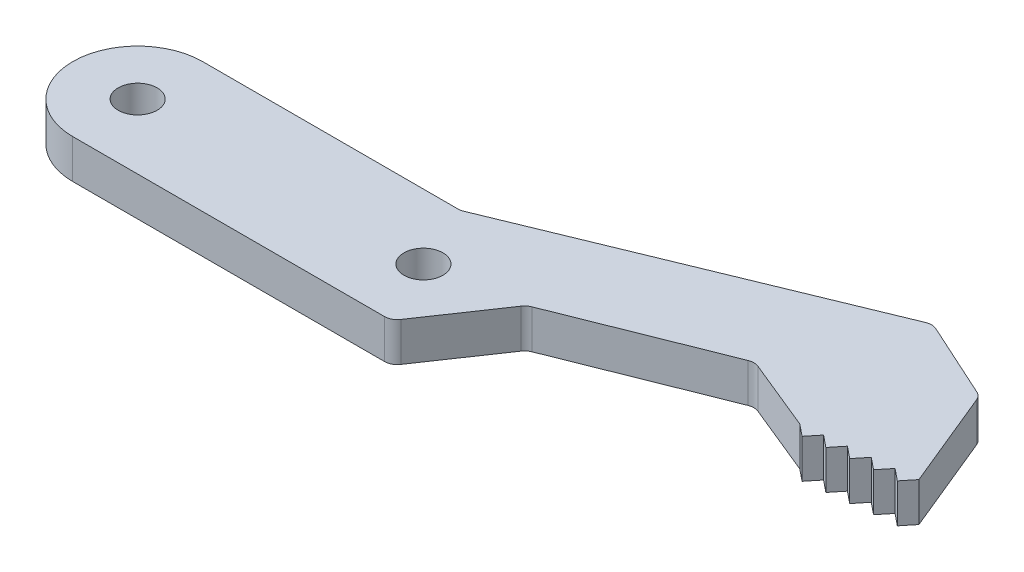
ISO-10303-21;
HEADER;
FILE_DESCRIPTION(('STEP AP214'),'2;1');
FILE_NAME('part.step','',(''),(''),'','','');
FILE_SCHEMA(('AUTOMOTIVE_DESIGN { 1 0 10303 214 1 1 1 1 }'));
ENDSEC;
DATA;
#1=APPLICATION_CONTEXT('core data for automotive mechanical design processes');
#2=APPLICATION_PROTOCOL_DEFINITION('international standard','automotive_design',2000,#1);
#3=PRODUCT_CONTEXT('',#1,'mechanical');
#4=PRODUCT('Part','Part','',(#3));
#5=PRODUCT_RELATED_PRODUCT_CATEGORY('part','',(#4));
#6=PRODUCT_DEFINITION_FORMATION('','',#4);
#7=PRODUCT_DEFINITION_CONTEXT('part definition',#1,'design');
#8=PRODUCT_DEFINITION('design','',#6,#7);
#9=PRODUCT_DEFINITION_SHAPE('','',#8);
#10=(LENGTH_UNIT() NAMED_UNIT(*) SI_UNIT(.MILLI.,.METRE.));
#11=(NAMED_UNIT(*) PLANE_ANGLE_UNIT() SI_UNIT($,.RADIAN.));
#12=(NAMED_UNIT(*) SI_UNIT($,.STERADIAN.) SOLID_ANGLE_UNIT());
#13=UNCERTAINTY_MEASURE_WITH_UNIT(LENGTH_MEASURE(1.E-05),#10,'distance_accuracy_value','');
#14=(GEOMETRIC_REPRESENTATION_CONTEXT(3) GLOBAL_UNCERTAINTY_ASSIGNED_CONTEXT((#13)) GLOBAL_UNIT_ASSIGNED_CONTEXT((#10,
#11,#12)) REPRESENTATION_CONTEXT('',''));
#15=CARTESIAN_POINT('',(0.,0.,0.));
#16=DIRECTION('',(0.,0.,1.));
#17=DIRECTION('',(1.,0.,0.));
#18=AXIS2_PLACEMENT_3D('',#15,#16,#17);
#19=CARTESIAN_POINT('',(29.3927079970185,3.,-0.393076672311641));
#20=DIRECTION('',(0.,-1.,0.));
#21=DIRECTION('',(0.,0.,-1.));
#22=AXIS2_PLACEMENT_3D('',#19,#20,#21);
#23=PLANE('',#22);
#24=CARTESIAN_POINT('',(29.3927079970185,3.,-0.393076672311641));
#25=DIRECTION('',(0.,-1.,0.));
#26=DIRECTION('',(0.,0.,-1.));
#27=AXIS2_PLACEMENT_3D('',#24,#25,#26);
#28=CIRCLE('',#27,1.);
#29=CARTESIAN_POINT('',(28.5649413257824,3.,-0.954149161381216));
#30=VERTEX_POINT('',#29);
#31=CARTESIAN_POINT('',(29.022312673,3.,-1.32195088551018));
#32=VERTEX_POINT('',#31);
#33=EDGE_CURVE('E285',#30,#32,#28,.T.);
#34=ORIENTED_EDGE('',*,*,#33,.T.);
#35=DIRECTION('',(0.92887421319854,0.,-0.370395324018532));
#36=VECTOR('',#35,1.);
#37=CARTESIAN_POINT('',(29.022312673,3.,-1.32195088551018));
#38=LINE('',#37,#36);
#39=CARTESIAN_POINT('',(40.9295532164884,3.,-6.07004934341117));
#40=VERTEX_POINT('',#39);
#41=EDGE_CURVE('E148',#32,#40,#38,.T.);
#42=ORIENTED_EDGE('',*,*,#41,.T.);
#43=CARTESIAN_POINT('',(41.2999485405069,3.,-5.14117513021263));
#44=DIRECTION('',(0.,-1.,0.));
#45=DIRECTION('',(0.,0.,-1.));
#46=AXIS2_PLACEMENT_3D('',#43,#44,#45);
#47=CIRCLE('',#46,1.);
#48=CARTESIAN_POINT('',(41.6787586893829,3.,-6.06664953348294));
#49=VERTEX_POINT('',#48);
#50=EDGE_CURVE('E351',#40,#49,#47,.T.);
#51=ORIENTED_EDGE('',*,*,#50,.T.);
#52=DIRECTION('',(0.925474403270305,0.,0.378810148876022));
#53=VECTOR('',#52,1.);
#54=CARTESIAN_POINT('',(41.6787586893829,3.,-6.06664953348294));
#55=LINE('',#54,#53);
#56=CARTESIAN_POINT('',(47.1445862437582,3.,-3.82940672883367));
#57=VERTEX_POINT('',#56);
#58=EDGE_CURVE('E370',#49,#57,#55,.T.);
#59=ORIENTED_EDGE('',*,*,#58,.T.);
#60=DIRECTION('',(0.777249081254573,0.,0.629193027368329));
#61=VECTOR('',#60,1.);
#62=CARTESIAN_POINT('',(47.1445862437582,3.,-3.82940672883367));
#63=LINE('',#62,#61);
#64=CARTESIAN_POINT('',(48.0617401596386,3.,-3.08695895653906));
#65=VERTEX_POINT('',#64);
#66=EDGE_CURVE('E367',#57,#65,#63,.T.);
#67=ORIENTED_EDGE('',*,*,#66,.T.);
#68=DIRECTION('',(0.629193027368274,0.,-0.777249081254617));
#69=VECTOR('',#68,1.);
#70=CARTESIAN_POINT('',(48.0617401596386,3.,-3.08695895653906));
#71=LINE('',#70,#69);
#72=CARTESIAN_POINT('',(48.8041879319331,3.,-4.0041128724195));
#73=VERTEX_POINT('',#72);
#74=EDGE_CURVE('E369',#65,#73,#71,.T.);
#75=ORIENTED_EDGE('',*,*,#74,.T.);
#76=DIRECTION('',(0.777249081254579,0.,0.62919302736832));
#77=VECTOR('',#76,1.);
#78=CARTESIAN_POINT('',(48.8041879319331,3.,-4.0041128724195));
#79=LINE('',#78,#77);
#80=CARTESIAN_POINT('',(49.7213418478136,3.,-3.26166510012488));
#81=VERTEX_POINT('',#80);
#82=EDGE_CURVE('E372',#73,#81,#79,.T.);
#83=ORIENTED_EDGE('',*,*,#82,.T.);
#84=DIRECTION('',(0.629193027368325,0.,-0.777249081254575));
#85=VECTOR('',#84,1.);
#86=CARTESIAN_POINT('',(49.7213418478136,3.,-3.26166510012488));
#87=LINE('',#86,#85);
#88=CARTESIAN_POINT('',(50.4637896201082,3.,-4.17881901600528));
#89=VERTEX_POINT('',#88);
#90=EDGE_CURVE('E378',#81,#89,#87,.T.);
#91=ORIENTED_EDGE('',*,*,#90,.T.);
#92=DIRECTION('',(0.777249081254577,0.,0.629193027368323));
#93=VECTOR('',#92,1.);
#94=CARTESIAN_POINT('',(50.4637896201082,3.,-4.17881901600528));
#95=LINE('',#94,#93);
#96=CARTESIAN_POINT('',(51.3809435359886,3.,-3.43637124371065));
#97=VERTEX_POINT('',#96);
#98=EDGE_CURVE('E380',#89,#97,#95,.T.);
#99=ORIENTED_EDGE('',*,*,#98,.T.);
#100=DIRECTION('',(0.629193027368326,0.,-0.777249081254575));
#101=VECTOR('',#100,1.);
#102=CARTESIAN_POINT('',(51.3809435359886,3.,-3.43637124371065));
#103=LINE('',#102,#101);
#104=CARTESIAN_POINT('',(52.1233913082832,3.,-4.35352515959105));
#105=VERTEX_POINT('',#104);
#106=EDGE_CURVE('E382',#97,#105,#103,.T.);
#107=ORIENTED_EDGE('',*,*,#106,.T.);
#108=DIRECTION('',(0.777249081254583,0.,0.629193027368317));
#109=VECTOR('',#108,1.);
#110=CARTESIAN_POINT('',(52.1233913082832,3.,-4.35352515959105));
#111=LINE('',#110,#109);
#112=CARTESIAN_POINT('',(53.0405452241636,3.,-3.61107738729644));
#113=VERTEX_POINT('',#112);
#114=EDGE_CURVE('E384',#105,#113,#111,.T.);
#115=ORIENTED_EDGE('',*,*,#114,.T.);
#116=DIRECTION('',(0.629193027368326,0.,-0.777249081254575));
#117=VECTOR('',#116,1.);
#118=CARTESIAN_POINT('',(53.0405452241636,3.,-3.61107738729644));
#119=LINE('',#118,#117);
#120=CARTESIAN_POINT('',(53.7829929964582,3.,-4.52823130317683));
#121=VERTEX_POINT('',#120);
#122=EDGE_CURVE('E386',#113,#121,#119,.T.);
#123=ORIENTED_EDGE('',*,*,#122,.T.);
#124=DIRECTION('',(0.777249081254587,0.,0.629193027368311));
#125=VECTOR('',#124,1.);
#126=CARTESIAN_POINT('',(53.7829929964582,3.,-4.52823130317683));
#127=LINE('',#126,#125);
#128=CARTESIAN_POINT('',(54.7001469123387,3.,-3.78578353088222));
#129=VERTEX_POINT('',#128);
#130=EDGE_CURVE('E388',#121,#129,#127,.T.);
#131=ORIENTED_EDGE('',*,*,#130,.T.);
#132=DIRECTION('',(0.629193027368273,0.,-0.777249081254618));
#133=VECTOR('',#132,1.);
#134=CARTESIAN_POINT('',(54.7001469123387,3.,-3.78578353088222));
#135=LINE('',#134,#133);
#136=CARTESIAN_POINT('',(55.4425946846332,3.,-4.70293744676266));
#137=VERTEX_POINT('',#136);
#138=EDGE_CURVE('E390',#129,#137,#135,.T.);
#139=ORIENTED_EDGE('',*,*,#138,.T.);
#140=DIRECTION('',(-0.380263412733204,0.,-0.92487822816655));
#141=VECTOR('',#140,1.);
#142=CARTESIAN_POINT('',(52.341745918113,3.,-12.2448345027485));
#143=LINE('',#142,#141);
#144=CARTESIAN_POINT('',(52.341745918113,3.,-12.2448345027485));
#145=VERTEX_POINT('',#144);
#146=EDGE_CURVE('E392',#137,#145,#143,.T.);
#147=ORIENTED_EDGE('',*,*,#146,.T.);
#148=CARTESIAN_POINT('',(51.4168676899464,3.,-11.8645710900153));
#149=DIRECTION('',(0.,1.,0.));
#150=DIRECTION('',(0.,0.,-1.));
#151=AXIS2_PLACEMENT_3D('',#148,#149,#150);
#152=CIRCLE('',#151,1.);
#153=CARTESIAN_POINT('',(51.8314021080849,3.,-12.7746047246566));
#154=VERTEX_POINT('',#153);
#155=EDGE_CURVE('E394',#145,#154,#152,.T.);
#156=ORIENTED_EDGE('',*,*,#155,.T.);
#157=DIRECTION('',(-0.910033634641374,0.,-0.414534418138482));
#158=VECTOR('',#157,1.);
#159=CARTESIAN_POINT('',(46.0241839243038,3.,-15.4198825684427));
#160=LINE('',#159,#158);
#161=CARTESIAN_POINT('',(46.0241839243038,3.,-15.4198825684427));
#162=VERTEX_POINT('',#161);
#163=EDGE_CURVE('E396',#154,#162,#160,.T.);
#164=ORIENTED_EDGE('',*,*,#163,.T.);
#165=CARTESIAN_POINT('',(45.6096495061653,3.,-14.5098489338013));
#166=DIRECTION('',(0.,1.,0.));
#167=DIRECTION('',(0.,0.,-1.));
#168=AXIS2_PLACEMENT_3D('',#165,#166,#167);
#169=CIRCLE('',#168,1.);
#170=CARTESIAN_POINT('',(45.2293860934321,3.,-15.4347271619678));
#171=VERTEX_POINT('',#170);
#172=EDGE_CURVE('E398',#162,#171,#169,.T.);
#173=ORIENTED_EDGE('',*,*,#172,.T.);
#174=DIRECTION('',(-0.924878228166549,0.,0.380263412733207));
#175=VECTOR('',#174,1.);
#176=CARTESIAN_POINT('',(20.0327114807882,3.,-5.07512177183345));
#177=LINE('',#176,#175);
#178=CARTESIAN_POINT('',(20.0327114807882,3.,-5.07512177183345));
#179=VERTEX_POINT('',#178);
#180=EDGE_CURVE('E400',#171,#179,#177,.T.);
#181=ORIENTED_EDGE('',*,*,#180,.T.);
#182=CARTESIAN_POINT('',(19.652448068055,3.,-6.));
#183=DIRECTION('',(0.,-1.,0.));
#184=DIRECTION('',(0.,0.,1.));
#185=AXIS2_PLACEMENT_3D('',#182,#183,#184);
#186=CIRCLE('',#185,1.);
#187=CARTESIAN_POINT('',(19.652448068055,3.,-5.));
#188=VERTEX_POINT('',#187);
#189=EDGE_CURVE('E402',#179,#188,#186,.T.);
#190=ORIENTED_EDGE('',*,*,#189,.T.);
#191=DIRECTION('',(-1.,0.,0.));
#192=VECTOR('',#191,1.);
#193=CARTESIAN_POINT('',(0.,3.,-5.));
#194=LINE('',#193,#192);
#195=CARTESIAN_POINT('',(0.,3.,-5.));
#196=VERTEX_POINT('',#195);
#197=EDGE_CURVE('E404',#188,#196,#194,.T.);
#198=ORIENTED_EDGE('',*,*,#197,.T.);
#199=CARTESIAN_POINT('',(0.,3.,0.));
#200=DIRECTION('',(0.,1.,0.));
#201=DIRECTION('',(0.,0.,1.));
#202=AXIS2_PLACEMENT_3D('',#199,#200,#201);
#203=CIRCLE('',#202,5.);
#204=CARTESIAN_POINT('',(0.,3.,5.));
#205=VERTEX_POINT('',#204);
#206=EDGE_CURVE('E218',#196,#205,#203,.T.);
#207=ORIENTED_EDGE('',*,*,#206,.T.);
#208=DIRECTION('',(1.,0.,0.));
#209=VECTOR('',#208,1.);
#210=CARTESIAN_POINT('',(0.,3.,5.));
#211=LINE('',#210,#209);
#212=CARTESIAN_POINT('',(23.9988758721515,3.,5.));
#213=VERTEX_POINT('',#212);
#214=EDGE_CURVE('E212',#205,#213,#211,.T.);
#215=ORIENTED_EDGE('',*,*,#214,.T.);
#216=CARTESIAN_POINT('',(23.9988758721515,3.,4.));
#217=DIRECTION('',(0.,1.,0.));
#218=DIRECTION('',(0.,0.,1.));
#219=AXIS2_PLACEMENT_3D('',#216,#217,#218);
#220=CIRCLE('',#219,1.);
#221=CARTESIAN_POINT('',(24.8266425433876,3.,4.56107248906957));
#222=VERTEX_POINT('',#221);
#223=EDGE_CURVE('E216',#213,#222,#220,.T.);
#224=ORIENTED_EDGE('',*,*,#223,.T.);
#225=DIRECTION('',(0.561072489069578,0.,-0.827766671236085));
#226=VECTOR('',#225,1.);
#227=CARTESIAN_POINT('',(24.8266425433876,3.,4.56107248906957));
#228=LINE('',#227,#226);
#229=EDGE_CURVE('E54',#222,#30,#228,.T.);
#230=ORIENTED_EDGE('',*,*,#229,.T.);
#231=EDGE_LOOP('',(#34,#42,#51,#59,#67,#75,#83,#91,#99,#107,#115,#123,#131,#139,#147,#156,#164,
#173,#181,#190,#198,#207,#215,#224,#230));
#232=FACE_BOUND('',#231,.T.);
#233=CARTESIAN_POINT('',(0.,3.,0.));
#234=DIRECTION('',(0.,1.,0.));
#235=DIRECTION('',(0.,0.,1.));
#236=AXIS2_PLACEMENT_3D('',#233,#234,#235);
#237=CIRCLE('',#236,1.5);
#238=CARTESIAN_POINT('',(0.,3.,1.5));
#239=VERTEX_POINT('',#238);
#240=EDGE_CURVE('E240',#239,#239,#237,.T.);
#241=ORIENTED_EDGE('',*,*,#240,.F.);
#242=EDGE_LOOP('',(#241));
#243=FACE_BOUND('',#242,.T.);
#244=CARTESIAN_POINT('',(22.,3.,0.));
#245=DIRECTION('',(0.,1.,0.));
#246=DIRECTION('',(0.,0.,1.));
#247=AXIS2_PLACEMENT_3D('',#244,#245,#246);
#248=CIRCLE('',#247,1.5);
#249=CARTESIAN_POINT('',(22.,3.,1.5));
#250=VERTEX_POINT('',#249);
#251=EDGE_CURVE('E445',#250,#250,#248,.T.);
#252=ORIENTED_EDGE('',*,*,#251,.F.);
#253=EDGE_LOOP('',(#252));
#254=FACE_BOUND('',#253,.T.);
#255=ADVANCED_FACE('F37',(#232,#243,#254),#23,.F.);
#256=CARTESIAN_POINT('',(29.3927079970185,0.,-0.393076672311641));
#257=DIRECTION('',(0.,-1.,0.));
#258=DIRECTION('',(0.,0.,-1.));
#259=AXIS2_PLACEMENT_3D('',#256,#257,#258);
#260=PLANE('',#259);
#261=CARTESIAN_POINT('',(0.,0.,0.));
#262=DIRECTION('',(0.,1.,0.));
#263=DIRECTION('',(0.,0.,1.));
#264=AXIS2_PLACEMENT_3D('',#261,#262,#263);
#265=CIRCLE('',#264,1.5);
#266=CARTESIAN_POINT('',(0.,0.,1.5));
#267=VERTEX_POINT('',#266);
#268=EDGE_CURVE('E450',#267,#267,#265,.T.);
#269=ORIENTED_EDGE('',*,*,#268,.T.);
#270=EDGE_LOOP('',(#269));
#271=FACE_BOUND('',#270,.T.);
#272=CARTESIAN_POINT('',(29.3927079970185,0.,-0.393076672311641));
#273=DIRECTION('',(0.,-1.,0.));
#274=DIRECTION('',(0.,0.,-1.));
#275=AXIS2_PLACEMENT_3D('',#272,#273,#274);
#276=CIRCLE('',#275,1.);
#277=CARTESIAN_POINT('',(28.5649413257824,0.,-0.954149161381216));
#278=VERTEX_POINT('',#277);
#279=CARTESIAN_POINT('',(29.022312673,0.,-1.32195088551018));
#280=VERTEX_POINT('',#279);
#281=EDGE_CURVE('E236',#278,#280,#276,.T.);
#282=ORIENTED_EDGE('',*,*,#281,.F.);
#283=DIRECTION('',(0.561072489069578,0.,-0.827766671236085));
#284=VECTOR('',#283,1.);
#285=CARTESIAN_POINT('',(24.8266425433876,0.,4.56107248906957));
#286=LINE('',#285,#284);
#287=CARTESIAN_POINT('',(24.8266425433876,0.,4.56107248906957));
#288=VERTEX_POINT('',#287);
#289=EDGE_CURVE('E140',#288,#278,#286,.T.);
#290=ORIENTED_EDGE('',*,*,#289,.F.);
#291=CARTESIAN_POINT('',(23.9988758721515,0.,4.));
#292=DIRECTION('',(0.,1.,0.));
#293=DIRECTION('',(0.,0.,1.));
#294=AXIS2_PLACEMENT_3D('',#291,#292,#293);
#295=CIRCLE('',#294,1.);
#296=CARTESIAN_POINT('',(23.9988758721515,0.,5.));
#297=VERTEX_POINT('',#296);
#298=EDGE_CURVE('E134',#297,#288,#295,.T.);
#299=ORIENTED_EDGE('',*,*,#298,.F.);
#300=DIRECTION('',(1.,0.,0.));
#301=VECTOR('',#300,1.);
#302=CARTESIAN_POINT('',(0.,0.,5.));
#303=LINE('',#302,#301);
#304=CARTESIAN_POINT('',(0.,0.,5.));
#305=VERTEX_POINT('',#304);
#306=EDGE_CURVE('E226',#305,#297,#303,.T.);
#307=ORIENTED_EDGE('',*,*,#306,.F.);
#308=CARTESIAN_POINT('',(0.,0.,0.));
#309=DIRECTION('',(0.,1.,0.));
#310=DIRECTION('',(0.,0.,1.));
#311=AXIS2_PLACEMENT_3D('',#308,#309,#310);
#312=CIRCLE('',#311,5.);
#313=CARTESIAN_POINT('',(0.,0.,-5.));
#314=VERTEX_POINT('',#313);
#315=EDGE_CURVE('E280',#314,#305,#312,.T.);
#316=ORIENTED_EDGE('',*,*,#315,.F.);
#317=DIRECTION('',(-1.,0.,0.));
#318=VECTOR('',#317,1.);
#319=CARTESIAN_POINT('',(0.,0.,-5.));
#320=LINE('',#319,#318);
#321=CARTESIAN_POINT('',(19.652448068055,0.,-5.));
#322=VERTEX_POINT('',#321);
#323=EDGE_CURVE('E278',#322,#314,#320,.T.);
#324=ORIENTED_EDGE('',*,*,#323,.F.);
#325=CARTESIAN_POINT('',(19.652448068055,0.,-6.));
#326=DIRECTION('',(0.,-1.,0.));
#327=DIRECTION('',(0.,0.,1.));
#328=AXIS2_PLACEMENT_3D('',#325,#326,#327);
#329=CIRCLE('',#328,1.);
#330=CARTESIAN_POINT('',(20.0327114807882,0.,-5.07512177183345));
#331=VERTEX_POINT('',#330);
#332=EDGE_CURVE('E276',#331,#322,#329,.T.);
#333=ORIENTED_EDGE('',*,*,#332,.F.);
#334=DIRECTION('',(-0.924878228166549,0.,0.380263412733207));
#335=VECTOR('',#334,1.);
#336=CARTESIAN_POINT('',(20.0327114807882,0.,-5.07512177183345));
#337=LINE('',#336,#335);
#338=CARTESIAN_POINT('',(45.2293860934321,0.,-15.4347271619678));
#339=VERTEX_POINT('',#338);
#340=EDGE_CURVE('E274',#339,#331,#337,.T.);
#341=ORIENTED_EDGE('',*,*,#340,.F.);
#342=CARTESIAN_POINT('',(45.6096495061653,0.,-14.5098489338013));
#343=DIRECTION('',(0.,1.,0.));
#344=DIRECTION('',(0.,0.,-1.));
#345=AXIS2_PLACEMENT_3D('',#342,#343,#344);
#346=CIRCLE('',#345,1.);
#347=CARTESIAN_POINT('',(46.0241839243038,0.,-15.4198825684427));
#348=VERTEX_POINT('',#347);
#349=EDGE_CURVE('E272',#348,#339,#346,.T.);
#350=ORIENTED_EDGE('',*,*,#349,.F.);
#351=DIRECTION('',(-0.910033634641374,0.,-0.414534418138482));
#352=VECTOR('',#351,1.);
#353=CARTESIAN_POINT('',(46.0241839243038,0.,-15.4198825684427));
#354=LINE('',#353,#352);
#355=CARTESIAN_POINT('',(51.8314021080849,0.,-12.7746047246566));
#356=VERTEX_POINT('',#355);
#357=EDGE_CURVE('E270',#356,#348,#354,.T.);
#358=ORIENTED_EDGE('',*,*,#357,.F.);
#359=CARTESIAN_POINT('',(51.4168676899464,0.,-11.8645710900153));
#360=DIRECTION('',(0.,1.,0.));
#361=DIRECTION('',(0.,0.,-1.));
#362=AXIS2_PLACEMENT_3D('',#359,#360,#361);
#363=CIRCLE('',#362,1.);
#364=CARTESIAN_POINT('',(52.341745918113,0.,-12.2448345027485));
#365=VERTEX_POINT('',#364);
#366=EDGE_CURVE('E268',#365,#356,#363,.T.);
#367=ORIENTED_EDGE('',*,*,#366,.F.);
#368=DIRECTION('',(-0.380263412733204,0.,-0.92487822816655));
#369=VECTOR('',#368,1.);
#370=CARTESIAN_POINT('',(52.341745918113,0.,-12.2448345027485));
#371=LINE('',#370,#369);
#372=CARTESIAN_POINT('',(55.4425946846332,0.,-4.70293744676266));
#373=VERTEX_POINT('',#372);
#374=EDGE_CURVE('E266',#373,#365,#371,.T.);
#375=ORIENTED_EDGE('',*,*,#374,.F.);
#376=DIRECTION('',(0.629193027368273,0.,-0.777249081254618));
#377=VECTOR('',#376,1.);
#378=CARTESIAN_POINT('',(54.7001469123387,0.,-3.78578353088222));
#379=LINE('',#378,#377);
#380=CARTESIAN_POINT('',(54.7001469123387,0.,-3.78578353088222));
#381=VERTEX_POINT('',#380);
#382=EDGE_CURVE('E264',#381,#373,#379,.T.);
#383=ORIENTED_EDGE('',*,*,#382,.F.);
#384=DIRECTION('',(0.777249081254587,0.,0.629193027368311));
#385=VECTOR('',#384,1.);
#386=CARTESIAN_POINT('',(53.7829929964582,0.,-4.52823130317683));
#387=LINE('',#386,#385);
#388=CARTESIAN_POINT('',(53.7829929964582,0.,-4.52823130317683));
#389=VERTEX_POINT('',#388);
#390=EDGE_CURVE('E262',#389,#381,#387,.T.);
#391=ORIENTED_EDGE('',*,*,#390,.F.);
#392=DIRECTION('',(0.629193027368326,0.,-0.777249081254575));
#393=VECTOR('',#392,1.);
#394=CARTESIAN_POINT('',(53.0405452241636,0.,-3.61107738729644));
#395=LINE('',#394,#393);
#396=CARTESIAN_POINT('',(53.0405452241636,0.,-3.61107738729644));
#397=VERTEX_POINT('',#396);
#398=EDGE_CURVE('E260',#397,#389,#395,.T.);
#399=ORIENTED_EDGE('',*,*,#398,.F.);
#400=DIRECTION('',(0.777249081254583,0.,0.629193027368317));
#401=VECTOR('',#400,1.);
#402=CARTESIAN_POINT('',(52.1233913082832,0.,-4.35352515959105));
#403=LINE('',#402,#401);
#404=CARTESIAN_POINT('',(52.1233913082832,0.,-4.35352515959105));
#405=VERTEX_POINT('',#404);
#406=EDGE_CURVE('E258',#405,#397,#403,.T.);
#407=ORIENTED_EDGE('',*,*,#406,.F.);
#408=DIRECTION('',(0.629193027368326,0.,-0.777249081254575));
#409=VECTOR('',#408,1.);
#410=CARTESIAN_POINT('',(51.3809435359886,0.,-3.43637124371065));
#411=LINE('',#410,#409);
#412=CARTESIAN_POINT('',(51.3809435359886,0.,-3.43637124371065));
#413=VERTEX_POINT('',#412);
#414=EDGE_CURVE('E256',#413,#405,#411,.T.);
#415=ORIENTED_EDGE('',*,*,#414,.F.);
#416=DIRECTION('',(0.777249081254577,0.,0.629193027368323));
#417=VECTOR('',#416,1.);
#418=CARTESIAN_POINT('',(50.4637896201082,0.,-4.17881901600528));
#419=LINE('',#418,#417);
#420=CARTESIAN_POINT('',(50.4637896201082,0.,-4.17881901600528));
#421=VERTEX_POINT('',#420);
#422=EDGE_CURVE('E254',#421,#413,#419,.T.);
#423=ORIENTED_EDGE('',*,*,#422,.F.);
#424=DIRECTION('',(0.629193027368325,0.,-0.777249081254575));
#425=VECTOR('',#424,1.);
#426=CARTESIAN_POINT('',(49.7213418478136,0.,-3.26166510012488));
#427=LINE('',#426,#425);
#428=CARTESIAN_POINT('',(49.7213418478136,0.,-3.26166510012488));
#429=VERTEX_POINT('',#428);
#430=EDGE_CURVE('E252',#429,#421,#427,.T.);
#431=ORIENTED_EDGE('',*,*,#430,.F.);
#432=DIRECTION('',(0.777249081254579,0.,0.62919302736832));
#433=VECTOR('',#432,1.);
#434=CARTESIAN_POINT('',(48.8041879319331,0.,-4.0041128724195));
#435=LINE('',#434,#433);
#436=CARTESIAN_POINT('',(48.8041879319331,0.,-4.0041128724195));
#437=VERTEX_POINT('',#436);
#438=EDGE_CURVE('E250',#437,#429,#435,.T.);
#439=ORIENTED_EDGE('',*,*,#438,.F.);
#440=DIRECTION('',(0.629193027368274,0.,-0.777249081254617));
#441=VECTOR('',#440,1.);
#442=CARTESIAN_POINT('',(48.0617401596386,0.,-3.08695895653906));
#443=LINE('',#442,#441);
#444=CARTESIAN_POINT('',(48.0617401596386,0.,-3.08695895653906));
#445=VERTEX_POINT('',#444);
#446=EDGE_CURVE('E248',#445,#437,#443,.T.);
#447=ORIENTED_EDGE('',*,*,#446,.F.);
#448=DIRECTION('',(0.777249081254573,0.,0.629193027368329));
#449=VECTOR('',#448,1.);
#450=CARTESIAN_POINT('',(47.1445862437582,0.,-3.82940672883367));
#451=LINE('',#450,#449);
#452=CARTESIAN_POINT('',(47.1445862437582,0.,-3.82940672883367));
#453=VERTEX_POINT('',#452);
#454=EDGE_CURVE('E246',#453,#445,#451,.T.);
#455=ORIENTED_EDGE('',*,*,#454,.F.);
#456=DIRECTION('',(0.925474403270305,0.,0.378810148876022));
#457=VECTOR('',#456,1.);
#458=CARTESIAN_POINT('',(41.6787586893829,0.,-6.06664953348294));
#459=LINE('',#458,#457);
#460=CARTESIAN_POINT('',(41.6787586893829,0.,-6.06664953348294));
#461=VERTEX_POINT('',#460);
#462=EDGE_CURVE('E244',#461,#453,#459,.T.);
#463=ORIENTED_EDGE('',*,*,#462,.F.);
#464=CARTESIAN_POINT('',(41.2999485405069,0.,-5.14117513021263));
#465=DIRECTION('',(0.,-1.,0.));
#466=DIRECTION('',(0.,0.,-1.));
#467=AXIS2_PLACEMENT_3D('',#464,#465,#466);
#468=CIRCLE('',#467,1.);
#469=CARTESIAN_POINT('',(40.9295532164884,0.,-6.07004934341117));
#470=VERTEX_POINT('',#469);
#471=EDGE_CURVE('E242',#470,#461,#468,.T.);
#472=ORIENTED_EDGE('',*,*,#471,.F.);
#473=DIRECTION('',(0.92887421319854,0.,-0.370395324018532));
#474=VECTOR('',#473,1.);
#475=CARTESIAN_POINT('',(29.022312673,0.,-1.32195088551018));
#476=LINE('',#475,#474);
#477=EDGE_CURVE('E239',#280,#470,#476,.T.);
#478=ORIENTED_EDGE('',*,*,#477,.F.);
#479=EDGE_LOOP('',(#282,#290,#299,#307,#316,#324,#333,#341,#350,#358,#367,#375,#383,#391,#399,
#407,#415,#423,#431,#439,#447,#455,#463,#472,#478));
#480=FACE_BOUND('',#479,.T.);
#481=CARTESIAN_POINT('',(22.,0.,0.));
#482=DIRECTION('',(0.,1.,0.));
#483=DIRECTION('',(0.,0.,1.));
#484=AXIS2_PLACEMENT_3D('',#481,#482,#483);
#485=CIRCLE('',#484,1.5);
#486=CARTESIAN_POINT('',(22.,0.,1.5));
#487=VERTEX_POINT('',#486);
#488=EDGE_CURVE('E448',#487,#487,#485,.T.);
#489=ORIENTED_EDGE('',*,*,#488,.T.);
#490=EDGE_LOOP('',(#489));
#491=FACE_BOUND('',#490,.T.);
#492=ADVANCED_FACE('F355',(#271,#480,#491),#260,.T.);
#493=CARTESIAN_POINT('',(29.3927079970185,3.,-0.393076672311641));
#494=DIRECTION('',(0.,-1.,0.));
#495=DIRECTION('',(0.,0.,-1.));
#496=AXIS2_PLACEMENT_3D('',#493,#494,#495);
#497=CYLINDRICAL_SURFACE('',#496,1.);
#498=ORIENTED_EDGE('',*,*,#281,.T.);
#499=DIRECTION('',(0.,-1.,0.));
#500=VECTOR('',#499,1.);
#501=CARTESIAN_POINT('',(29.022312673,3.,-1.32195088551018));
#502=LINE('',#501,#500);
#503=EDGE_CURVE('E11',#32,#280,#502,.T.);
#504=ORIENTED_EDGE('',*,*,#503,.F.);
#505=ORIENTED_EDGE('',*,*,#33,.F.);
#506=DIRECTION('',(0.,-1.,0.));
#507=VECTOR('',#506,1.);
#508=CARTESIAN_POINT('',(28.5649413257824,3.,-0.954149161381216));
#509=LINE('',#508,#507);
#510=EDGE_CURVE('E232',#30,#278,#509,.T.);
#511=ORIENTED_EDGE('',*,*,#510,.T.);
#512=EDGE_LOOP('',(#498,#504,#505,#511));
#513=FACE_BOUND('',#512,.T.);
#514=ADVANCED_FACE('F39',(#513),#497,.F.);
#515=CARTESIAN_POINT('',(29.022312673,3.,-1.32195088551018));
#516=DIRECTION('',(-0.370395324018532,0.,-0.92887421319854));
#517=DIRECTION('',(-0.92887421319854,0.,0.370395324018532));
#518=AXIS2_PLACEMENT_3D('',#515,#516,#517);
#519=PLANE('',#518);
#520=ORIENTED_EDGE('',*,*,#477,.T.);
#521=DIRECTION('',(0.,-1.,0.));
#522=VECTOR('',#521,1.);
#523=CARTESIAN_POINT('',(40.9295532164884,3.,-6.07004934341117));
#524=LINE('',#523,#522);
#525=EDGE_CURVE('E46',#40,#470,#524,.T.);
#526=ORIENTED_EDGE('',*,*,#525,.F.);
#527=ORIENTED_EDGE('',*,*,#41,.F.);
#528=ORIENTED_EDGE('',*,*,#503,.T.);
#529=EDGE_LOOP('',(#520,#526,#527,#528));
#530=FACE_BOUND('',#529,.T.);
#531=ADVANCED_FACE('F629',(#530),#519,.F.);
#532=CARTESIAN_POINT('',(41.2999485405069,3.,-5.14117513021263));
#533=DIRECTION('',(0.,-1.,0.));
#534=DIRECTION('',(0.,0.,-1.));
#535=AXIS2_PLACEMENT_3D('',#532,#533,#534);
#536=CYLINDRICAL_SURFACE('',#535,1.);
#537=ORIENTED_EDGE('',*,*,#471,.T.);
#538=DIRECTION('',(0.,-1.,0.));
#539=VECTOR('',#538,1.);
#540=CARTESIAN_POINT('',(41.6787586893829,3.,-6.06664953348294));
#541=LINE('',#540,#539);
#542=EDGE_CURVE('E343',#49,#461,#541,.T.);
#543=ORIENTED_EDGE('',*,*,#542,.F.);
#544=ORIENTED_EDGE('',*,*,#50,.F.);
#545=ORIENTED_EDGE('',*,*,#525,.T.);
#546=EDGE_LOOP('',(#537,#543,#544,#545));
#547=FACE_BOUND('',#546,.T.);
#548=ADVANCED_FACE('F349',(#547),#536,.F.);
#549=CARTESIAN_POINT('',(41.6787586893829,3.,-6.06664953348294));
#550=DIRECTION('',(0.378810148876022,0.,-0.925474403270305));
#551=DIRECTION('',(-0.925474403270305,0.,-0.378810148876022));
#552=AXIS2_PLACEMENT_3D('',#549,#550,#551);
#553=PLANE('',#552);
#554=ORIENTED_EDGE('',*,*,#462,.T.);
#555=DIRECTION('',(0.,-1.,0.));
#556=VECTOR('',#555,1.);
#557=CARTESIAN_POINT('',(47.1445862437582,3.,-3.82940672883367));
#558=LINE('',#557,#556);
#559=EDGE_CURVE('E340',#57,#453,#558,.T.);
#560=ORIENTED_EDGE('',*,*,#559,.F.);
#561=ORIENTED_EDGE('',*,*,#58,.F.);
#562=ORIENTED_EDGE('',*,*,#542,.T.);
#563=EDGE_LOOP('',(#554,#560,#561,#562));
#564=FACE_BOUND('',#563,.T.);
#565=ADVANCED_FACE('F361',(#564),#553,.F.);
#566=CARTESIAN_POINT('',(47.1445862437582,3.,-3.82940672883367));
#567=DIRECTION('',(0.629193027368329,0.,-0.777249081254573));
#568=DIRECTION('',(-0.777249081254573,0.,-0.629193027368329));
#569=AXIS2_PLACEMENT_3D('',#566,#567,#568);
#570=PLANE('',#569);
#571=ORIENTED_EDGE('',*,*,#454,.T.);
#572=DIRECTION('',(0.,-1.,0.));
#573=VECTOR('',#572,1.);
#574=CARTESIAN_POINT('',(48.0617401596386,3.,-3.08695895653906));
#575=LINE('',#574,#573);
#576=EDGE_CURVE('E337',#65,#445,#575,.T.);
#577=ORIENTED_EDGE('',*,*,#576,.F.);
#578=ORIENTED_EDGE('',*,*,#66,.F.);
#579=ORIENTED_EDGE('',*,*,#559,.T.);
#580=EDGE_LOOP('',(#571,#577,#578,#579));
#581=FACE_BOUND('',#580,.T.);
#582=ADVANCED_FACE('F365',(#581),#570,.F.);
#583=CARTESIAN_POINT('',(48.0617401596386,3.,-3.08695895653906));
#584=DIRECTION('',(-0.777249081254617,0.,-0.629193027368274));
#585=DIRECTION('',(-0.629193027368274,0.,0.777249081254617));
#586=AXIS2_PLACEMENT_3D('',#583,#584,#585);
#587=PLANE('',#586);
#588=ORIENTED_EDGE('',*,*,#446,.T.);
#589=DIRECTION('',(0.,-1.,0.));
#590=VECTOR('',#589,1.);
#591=CARTESIAN_POINT('',(48.8041879319331,3.,-4.0041128724195));
#592=LINE('',#591,#590);
#593=EDGE_CURVE('E334',#73,#437,#592,.T.);
#594=ORIENTED_EDGE('',*,*,#593,.F.);
#595=ORIENTED_EDGE('',*,*,#74,.F.);
#596=ORIENTED_EDGE('',*,*,#576,.T.);
#597=EDGE_LOOP('',(#588,#594,#595,#596));
#598=FACE_BOUND('',#597,.T.);
#599=ADVANCED_FACE('F602',(#598),#587,.F.);
#600=CARTESIAN_POINT('',(48.8041879319331,3.,-4.0041128724195));
#601=DIRECTION('',(0.62919302736832,0.,-0.77724908125458));
#602=DIRECTION('',(-0.77724908125458,0.,-0.62919302736832));
#603=AXIS2_PLACEMENT_3D('',#600,#601,#602);
#604=PLANE('',#603);
#605=ORIENTED_EDGE('',*,*,#438,.T.);
#606=DIRECTION('',(0.,-1.,0.));
#607=VECTOR('',#606,1.);
#608=CARTESIAN_POINT('',(49.7213418478136,3.,-3.26166510012488));
#609=LINE('',#608,#607);
#610=EDGE_CURVE('E331',#81,#429,#609,.T.);
#611=ORIENTED_EDGE('',*,*,#610,.F.);
#612=ORIENTED_EDGE('',*,*,#82,.F.);
#613=ORIENTED_EDGE('',*,*,#593,.T.);
#614=EDGE_LOOP('',(#605,#611,#612,#613));
#615=FACE_BOUND('',#614,.T.);
#616=ADVANCED_FACE('F594',(#615),#604,.F.);
#617=CARTESIAN_POINT('',(49.7213418478136,3.,-3.26166510012488));
#618=DIRECTION('',(-0.777249081254575,0.,-0.629193027368325));
#619=DIRECTION('',(-0.629193027368325,0.,0.777249081254576));
#620=AXIS2_PLACEMENT_3D('',#617,#618,#619);
#621=PLANE('',#620);
#622=ORIENTED_EDGE('',*,*,#430,.T.);
#623=DIRECTION('',(0.,-1.,0.));
#624=VECTOR('',#623,1.);
#625=CARTESIAN_POINT('',(50.4637896201082,3.,-4.17881901600528));
#626=LINE('',#625,#624);
#627=EDGE_CURVE('E328',#89,#421,#626,.T.);
#628=ORIENTED_EDGE('',*,*,#627,.F.);
#629=ORIENTED_EDGE('',*,*,#90,.F.);
#630=ORIENTED_EDGE('',*,*,#610,.T.);
#631=EDGE_LOOP('',(#622,#628,#629,#630));
#632=FACE_BOUND('',#631,.T.);
#633=ADVANCED_FACE('F586',(#632),#621,.F.);
#634=CARTESIAN_POINT('',(50.4637896201082,3.,-4.17881901600528));
#635=DIRECTION('',(0.629193027368323,0.,-0.777249081254577));
#636=DIRECTION('',(-0.777249081254577,0.,-0.629193027368323));
#637=AXIS2_PLACEMENT_3D('',#634,#635,#636);
#638=PLANE('',#637);
#639=ORIENTED_EDGE('',*,*,#422,.T.);
#640=DIRECTION('',(0.,-1.,0.));
#641=VECTOR('',#640,1.);
#642=CARTESIAN_POINT('',(51.3809435359886,3.,-3.43637124371065));
#643=LINE('',#642,#641);
#644=EDGE_CURVE('E325',#97,#413,#643,.T.);
#645=ORIENTED_EDGE('',*,*,#644,.F.);
#646=ORIENTED_EDGE('',*,*,#98,.F.);
#647=ORIENTED_EDGE('',*,*,#627,.T.);
#648=EDGE_LOOP('',(#639,#645,#646,#647));
#649=FACE_BOUND('',#648,.T.);
#650=ADVANCED_FACE('F578',(#649),#638,.F.);
#651=CARTESIAN_POINT('',(51.3809435359886,3.,-3.43637124371065));
#652=DIRECTION('',(-0.777249081254575,0.,-0.629193027368326));
#653=DIRECTION('',(-0.629193027368326,0.,0.777249081254575));
#654=AXIS2_PLACEMENT_3D('',#651,#652,#653);
#655=PLANE('',#654);
#656=ORIENTED_EDGE('',*,*,#414,.T.);
#657=DIRECTION('',(0.,-1.,0.));
#658=VECTOR('',#657,1.);
#659=CARTESIAN_POINT('',(52.1233913082832,3.,-4.35352515959105));
#660=LINE('',#659,#658);
#661=EDGE_CURVE('E322',#105,#405,#660,.T.);
#662=ORIENTED_EDGE('',*,*,#661,.F.);
#663=ORIENTED_EDGE('',*,*,#106,.F.);
#664=ORIENTED_EDGE('',*,*,#644,.T.);
#665=EDGE_LOOP('',(#656,#662,#663,#664));
#666=FACE_BOUND('',#665,.T.);
#667=ADVANCED_FACE('F570',(#666),#655,.F.);
#668=CARTESIAN_POINT('',(52.1233913082832,3.,-4.35352515959105));
#669=DIRECTION('',(0.629193027368317,0.,-0.777249081254583));
#670=DIRECTION('',(-0.777249081254583,0.,-0.629193027368317));
#671=AXIS2_PLACEMENT_3D('',#668,#669,#670);
#672=PLANE('',#671);
#673=ORIENTED_EDGE('',*,*,#406,.T.);
#674=DIRECTION('',(0.,-1.,0.));
#675=VECTOR('',#674,1.);
#676=CARTESIAN_POINT('',(53.0405452241636,3.,-3.61107738729644));
#677=LINE('',#676,#675);
#678=EDGE_CURVE('E319',#113,#397,#677,.T.);
#679=ORIENTED_EDGE('',*,*,#678,.F.);
#680=ORIENTED_EDGE('',*,*,#114,.F.);
#681=ORIENTED_EDGE('',*,*,#661,.T.);
#682=EDGE_LOOP('',(#673,#679,#680,#681));
#683=FACE_BOUND('',#682,.T.);
#684=ADVANCED_FACE('F562',(#683),#672,.F.);
#685=CARTESIAN_POINT('',(53.0405452241636,3.,-3.61107738729644));
#686=DIRECTION('',(-0.777249081254575,0.,-0.629193027368326));
#687=DIRECTION('',(-0.629193027368326,0.,0.777249081254575));
#688=AXIS2_PLACEMENT_3D('',#685,#686,#687);
#689=PLANE('',#688);
#690=ORIENTED_EDGE('',*,*,#398,.T.);
#691=DIRECTION('',(0.,-1.,0.));
#692=VECTOR('',#691,1.);
#693=CARTESIAN_POINT('',(53.7829929964582,3.,-4.52823130317683));
#694=LINE('',#693,#692);
#695=EDGE_CURVE('E316',#121,#389,#694,.T.);
#696=ORIENTED_EDGE('',*,*,#695,.F.);
#697=ORIENTED_EDGE('',*,*,#122,.F.);
#698=ORIENTED_EDGE('',*,*,#678,.T.);
#699=EDGE_LOOP('',(#690,#696,#697,#698));
#700=FACE_BOUND('',#699,.T.);
#701=ADVANCED_FACE('F554',(#700),#689,.F.);
#702=CARTESIAN_POINT('',(53.7829929964582,3.,-4.52823130317683));
#703=DIRECTION('',(0.629193027368311,0.,-0.777249081254587));
#704=DIRECTION('',(-0.777249081254587,0.,-0.629193027368311));
#705=AXIS2_PLACEMENT_3D('',#702,#703,#704);
#706=PLANE('',#705);
#707=ORIENTED_EDGE('',*,*,#390,.T.);
#708=DIRECTION('',(0.,-1.,0.));
#709=VECTOR('',#708,1.);
#710=CARTESIAN_POINT('',(54.7001469123387,3.,-3.78578353088222));
#711=LINE('',#710,#709);
#712=EDGE_CURVE('E313',#129,#381,#711,.T.);
#713=ORIENTED_EDGE('',*,*,#712,.F.);
#714=ORIENTED_EDGE('',*,*,#130,.F.);
#715=ORIENTED_EDGE('',*,*,#695,.T.);
#716=EDGE_LOOP('',(#707,#713,#714,#715));
#717=FACE_BOUND('',#716,.T.);
#718=ADVANCED_FACE('F546',(#717),#706,.F.);
#719=CARTESIAN_POINT('',(54.7001469123387,3.,-3.78578353088222));
#720=DIRECTION('',(-0.777249081254618,0.,-0.629193027368273));
#721=DIRECTION('',(-0.629193027368273,0.,0.777249081254618));
#722=AXIS2_PLACEMENT_3D('',#719,#720,#721);
#723=PLANE('',#722);
#724=ORIENTED_EDGE('',*,*,#382,.T.);
#725=DIRECTION('',(0.,-1.,0.));
#726=VECTOR('',#725,1.);
#727=CARTESIAN_POINT('',(55.4425946846332,3.,-4.70293744676266));
#728=LINE('',#727,#726);
#729=EDGE_CURVE('E310',#137,#373,#728,.T.);
#730=ORIENTED_EDGE('',*,*,#729,.F.);
#731=ORIENTED_EDGE('',*,*,#138,.F.);
#732=ORIENTED_EDGE('',*,*,#712,.T.);
#733=EDGE_LOOP('',(#724,#730,#731,#732));
#734=FACE_BOUND('',#733,.T.);
#735=ADVANCED_FACE('F538',(#734),#723,.F.);
#736=CARTESIAN_POINT('',(52.341745918113,3.,-12.2448345027485));
#737=DIRECTION('',(-0.92487822816655,0.,0.380263412733204));
#738=DIRECTION('',(0.380263412733204,0.,0.92487822816655));
#739=AXIS2_PLACEMENT_3D('',#736,#737,#738);
#740=PLANE('',#739);
#741=ORIENTED_EDGE('',*,*,#374,.T.);
#742=DIRECTION('',(0.,-1.,0.));
#743=VECTOR('',#742,1.);
#744=CARTESIAN_POINT('',(52.341745918113,3.,-12.2448345027485));
#745=LINE('',#744,#743);
#746=EDGE_CURVE('E307',#145,#365,#745,.T.);
#747=ORIENTED_EDGE('',*,*,#746,.F.);
#748=ORIENTED_EDGE('',*,*,#146,.F.);
#749=ORIENTED_EDGE('',*,*,#729,.T.);
#750=EDGE_LOOP('',(#741,#747,#748,#749));
#751=FACE_BOUND('',#750,.T.);
#752=ADVANCED_FACE('F530',(#751),#740,.F.);
#753=CARTESIAN_POINT('',(51.4168676899464,3.,-11.8645710900153));
#754=DIRECTION('',(0.,-1.,0.));
#755=DIRECTION('',(0.,0.,-1.));
#756=AXIS2_PLACEMENT_3D('',#753,#754,#755);
#757=CYLINDRICAL_SURFACE('',#756,1.);
#758=ORIENTED_EDGE('',*,*,#366,.T.);
#759=DIRECTION('',(0.,-1.,0.));
#760=VECTOR('',#759,1.);
#761=CARTESIAN_POINT('',(51.8314021080849,3.,-12.7746047246566));
#762=LINE('',#761,#760);
#763=EDGE_CURVE('E304',#154,#356,#762,.T.);
#764=ORIENTED_EDGE('',*,*,#763,.F.);
#765=ORIENTED_EDGE('',*,*,#155,.F.);
#766=ORIENTED_EDGE('',*,*,#746,.T.);
#767=EDGE_LOOP('',(#758,#764,#765,#766));
#768=FACE_BOUND('',#767,.T.);
#769=ADVANCED_FACE('F522',(#768),#757,.T.);
#770=CARTESIAN_POINT('',(46.0241839243038,3.,-15.4198825684427));
#771=DIRECTION('',(-0.414534418138482,0.,0.910033634641374));
#772=DIRECTION('',(0.910033634641374,0.,0.414534418138482));
#773=AXIS2_PLACEMENT_3D('',#770,#771,#772);
#774=PLANE('',#773);
#775=ORIENTED_EDGE('',*,*,#357,.T.);
#776=DIRECTION('',(0.,-1.,0.));
#777=VECTOR('',#776,1.);
#778=CARTESIAN_POINT('',(46.0241839243038,3.,-15.4198825684427));
#779=LINE('',#778,#777);
#780=EDGE_CURVE('E301',#162,#348,#779,.T.);
#781=ORIENTED_EDGE('',*,*,#780,.F.);
#782=ORIENTED_EDGE('',*,*,#163,.F.);
#783=ORIENTED_EDGE('',*,*,#763,.T.);
#784=EDGE_LOOP('',(#775,#781,#782,#783));
#785=FACE_BOUND('',#784,.T.);
#786=ADVANCED_FACE('F514',(#785),#774,.F.);
#787=CARTESIAN_POINT('',(45.6096495061653,3.,-14.5098489338013));
#788=DIRECTION('',(0.,-1.,0.));
#789=DIRECTION('',(0.,0.,-1.));
#790=AXIS2_PLACEMENT_3D('',#787,#788,#789);
#791=CYLINDRICAL_SURFACE('',#790,1.);
#792=ORIENTED_EDGE('',*,*,#349,.T.);
#793=DIRECTION('',(0.,-1.,0.));
#794=VECTOR('',#793,1.);
#795=CARTESIAN_POINT('',(45.2293860934321,3.,-15.4347271619678));
#796=LINE('',#795,#794);
#797=EDGE_CURVE('E298',#171,#339,#796,.T.);
#798=ORIENTED_EDGE('',*,*,#797,.F.);
#799=ORIENTED_EDGE('',*,*,#172,.F.);
#800=ORIENTED_EDGE('',*,*,#780,.T.);
#801=EDGE_LOOP('',(#792,#798,#799,#800));
#802=FACE_BOUND('',#801,.T.);
#803=ADVANCED_FACE('F506',(#802),#791,.T.);
#804=CARTESIAN_POINT('',(20.0327114807882,3.,-5.07512177183345));
#805=DIRECTION('',(0.380263412733207,0.,0.924878228166549));
#806=DIRECTION('',(0.924878228166549,0.,-0.380263412733207));
#807=AXIS2_PLACEMENT_3D('',#804,#805,#806);
#808=PLANE('',#807);
#809=ORIENTED_EDGE('',*,*,#340,.T.);
#810=DIRECTION('',(0.,-1.,0.));
#811=VECTOR('',#810,1.);
#812=CARTESIAN_POINT('',(20.0327114807882,3.,-5.07512177183345));
#813=LINE('',#812,#811);
#814=EDGE_CURVE('E295',#179,#331,#813,.T.);
#815=ORIENTED_EDGE('',*,*,#814,.F.);
#816=ORIENTED_EDGE('',*,*,#180,.F.);
#817=ORIENTED_EDGE('',*,*,#797,.T.);
#818=EDGE_LOOP('',(#809,#815,#816,#817));
#819=FACE_BOUND('',#818,.T.);
#820=ADVANCED_FACE('F498',(#819),#808,.F.);
#821=CARTESIAN_POINT('',(19.652448068055,3.,-6.));
#822=DIRECTION('',(0.,-1.,0.));
#823=DIRECTION('',(0.,0.,-1.));
#824=AXIS2_PLACEMENT_3D('',#821,#822,#823);
#825=CYLINDRICAL_SURFACE('',#824,1.);
#826=ORIENTED_EDGE('',*,*,#332,.T.);
#827=DIRECTION('',(0.,-1.,0.));
#828=VECTOR('',#827,1.);
#829=CARTESIAN_POINT('',(19.652448068055,3.,-5.));
#830=LINE('',#829,#828);
#831=EDGE_CURVE('E292',#188,#322,#830,.T.);
#832=ORIENTED_EDGE('',*,*,#831,.F.);
#833=ORIENTED_EDGE('',*,*,#189,.F.);
#834=ORIENTED_EDGE('',*,*,#814,.T.);
#835=EDGE_LOOP('',(#826,#832,#833,#834));
#836=FACE_BOUND('',#835,.T.);
#837=ADVANCED_FACE('F491',(#836),#825,.F.);
#838=CARTESIAN_POINT('',(0.,3.,-5.));
#839=DIRECTION('',(0.,0.,1.));
#840=DIRECTION('',(1.,0.,0.));
#841=AXIS2_PLACEMENT_3D('',#838,#839,#840);
#842=PLANE('',#841);
#843=ORIENTED_EDGE('',*,*,#323,.T.);
#844=DIRECTION('',(0.,-1.,0.));
#845=VECTOR('',#844,1.);
#846=CARTESIAN_POINT('',(0.,3.,-5.));
#847=LINE('',#846,#845);
#848=EDGE_CURVE('E289',#196,#314,#847,.T.);
#849=ORIENTED_EDGE('',*,*,#848,.F.);
#850=ORIENTED_EDGE('',*,*,#197,.F.);
#851=ORIENTED_EDGE('',*,*,#831,.T.);
#852=EDGE_LOOP('',(#843,#849,#850,#851));
#853=FACE_BOUND('',#852,.T.);
#854=ADVANCED_FACE('F410',(#853),#842,.F.);
#855=CARTESIAN_POINT('',(0.,3.,0.));
#856=DIRECTION('',(0.,-1.,0.));
#857=DIRECTION('',(0.,0.,-1.));
#858=AXIS2_PLACEMENT_3D('',#855,#856,#857);
#859=CYLINDRICAL_SURFACE('',#858,5.);
#860=ORIENTED_EDGE('',*,*,#315,.T.);
#861=DIRECTION('',(0.,-1.,0.));
#862=VECTOR('',#861,1.);
#863=CARTESIAN_POINT('',(0.,3.,5.));
#864=LINE('',#863,#862);
#865=EDGE_CURVE('E227',#205,#305,#864,.T.);
#866=ORIENTED_EDGE('',*,*,#865,.F.);
#867=ORIENTED_EDGE('',*,*,#206,.F.);
#868=ORIENTED_EDGE('',*,*,#848,.T.);
#869=EDGE_LOOP('',(#860,#866,#867,#868));
#870=FACE_BOUND('',#869,.T.);
#871=ADVANCED_FACE('F414',(#870),#859,.T.);
#872=CARTESIAN_POINT('',(0.,3.,5.));
#873=DIRECTION('',(0.,0.,-1.));
#874=DIRECTION('',(-1.,0.,0.));
#875=AXIS2_PLACEMENT_3D('',#872,#873,#874);
#876=PLANE('',#875);
#877=ORIENTED_EDGE('',*,*,#306,.T.);
#878=DIRECTION('',(0.,-1.,0.));
#879=VECTOR('',#878,1.);
#880=CARTESIAN_POINT('',(23.9988758721515,3.,5.));
#881=LINE('',#880,#879);
#882=EDGE_CURVE('E223',#213,#297,#881,.T.);
#883=ORIENTED_EDGE('',*,*,#882,.F.);
#884=ORIENTED_EDGE('',*,*,#214,.F.);
#885=ORIENTED_EDGE('',*,*,#865,.T.);
#886=EDGE_LOOP('',(#877,#883,#884,#885));
#887=FACE_BOUND('',#886,.T.);
#888=ADVANCED_FACE('F224',(#887),#876,.F.);
#889=CARTESIAN_POINT('',(23.9988758721515,3.,4.));
#890=DIRECTION('',(0.,-1.,0.));
#891=DIRECTION('',(0.,0.,-1.));
#892=AXIS2_PLACEMENT_3D('',#889,#890,#891);
#893=CYLINDRICAL_SURFACE('',#892,1.);
#894=ORIENTED_EDGE('',*,*,#298,.T.);
#895=DIRECTION('',(0.,-1.,0.));
#896=VECTOR('',#895,1.);
#897=CARTESIAN_POINT('',(24.8266425433876,3.,4.56107248906957));
#898=LINE('',#897,#896);
#899=EDGE_CURVE('E228',#222,#288,#898,.T.);
#900=ORIENTED_EDGE('',*,*,#899,.F.);
#901=ORIENTED_EDGE('',*,*,#223,.F.);
#902=ORIENTED_EDGE('',*,*,#882,.T.);
#903=EDGE_LOOP('',(#894,#900,#901,#902));
#904=FACE_BOUND('',#903,.T.);
#905=ADVANCED_FACE('F230',(#904),#893,.T.);
#906=CARTESIAN_POINT('',(24.8266425433876,3.,4.56107248906957));
#907=DIRECTION('',(-0.827766671236085,0.,-0.561072489069578));
#908=DIRECTION('',(-0.561072489069578,0.,0.827766671236085));
#909=AXIS2_PLACEMENT_3D('',#906,#907,#908);
#910=PLANE('',#909);
#911=ORIENTED_EDGE('',*,*,#289,.T.);
#912=ORIENTED_EDGE('',*,*,#510,.F.);
#913=ORIENTED_EDGE('',*,*,#229,.F.);
#914=ORIENTED_EDGE('',*,*,#899,.T.);
#915=EDGE_LOOP('',(#911,#912,#913,#914));
#916=FACE_BOUND('',#915,.T.);
#917=ADVANCED_FACE('F418',(#916),#910,.F.);
#918=CARTESIAN_POINT('',(0.,3.,0.));
#919=DIRECTION('',(0.,-1.,0.));
#920=DIRECTION('',(0.,0.,-1.));
#921=AXIS2_PLACEMENT_3D('',#918,#919,#920);
#922=CYLINDRICAL_SURFACE('',#921,1.5);
#923=ORIENTED_EDGE('',*,*,#240,.T.);
#924=EDGE_LOOP('',(#923));
#925=FACE_BOUND('',#924,.T.);
#926=ORIENTED_EDGE('',*,*,#268,.F.);
#927=EDGE_LOOP('',(#926));
#928=FACE_BOUND('',#927,.T.);
#929=ADVANCED_FACE('F420',(#925,#928),#922,.F.);
#930=CARTESIAN_POINT('',(22.,3.,0.));
#931=DIRECTION('',(0.,-1.,0.));
#932=DIRECTION('',(0.,0.,-1.));
#933=AXIS2_PLACEMENT_3D('',#930,#931,#932);
#934=CYLINDRICAL_SURFACE('',#933,1.5);
#935=ORIENTED_EDGE('',*,*,#251,.T.);
#936=EDGE_LOOP('',(#935));
#937=FACE_BOUND('',#936,.T.);
#938=ORIENTED_EDGE('',*,*,#488,.F.);
#939=EDGE_LOOP('',(#938));
#940=FACE_BOUND('',#939,.T.);
#941=ADVANCED_FACE('F426',(#937,#940),#934,.F.);
#942=CLOSED_SHELL('',(#255,#492,#514,#531,#548,#565,#582,#599,#616,#633,#650,#667,#684,#701,
#718,#735,#752,#769,#786,#803,#820,#837,#854,#871,#888,#905,#917,#929,#941));
#943=MANIFOLD_SOLID_BREP('B2',#942);
#944=ADVANCED_BREP_SHAPE_REPRESENTATION('',(#18,#943),#14);
#945=SHAPE_DEFINITION_REPRESENTATION(#9,#944);
ENDSEC;
END-ISO-10303-21;
